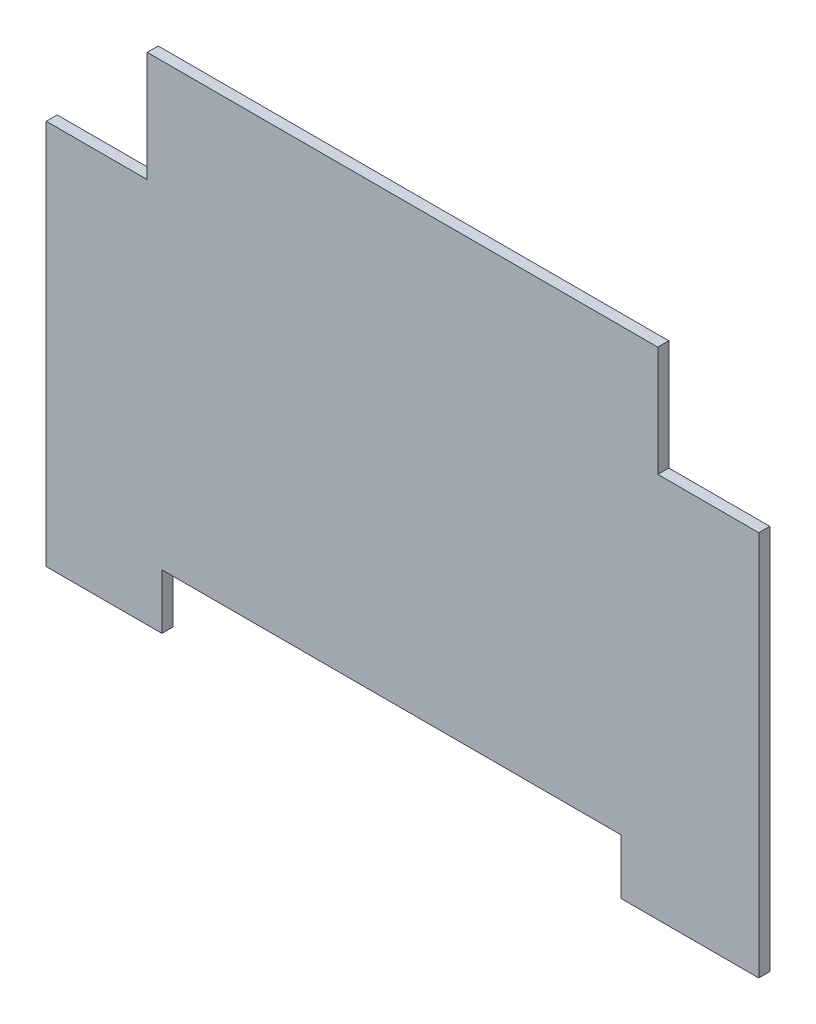
ISO-10303-21;
HEADER;
FILE_DESCRIPTION(('STEP AP214'),'2;1');
FILE_NAME('part.step','',(''),(''),'','','');
FILE_SCHEMA(('AUTOMOTIVE_DESIGN { 1 0 10303 214 1 1 1 1 }'));
ENDSEC;
DATA;
#1=APPLICATION_CONTEXT('core data for automotive mechanical design processes');
#2=APPLICATION_PROTOCOL_DEFINITION('international standard','automotive_design',2000,#1);
#3=PRODUCT_CONTEXT('',#1,'mechanical');
#4=PRODUCT('Part','Part','',(#3));
#5=PRODUCT_RELATED_PRODUCT_CATEGORY('part','',(#4));
#6=PRODUCT_DEFINITION_FORMATION('','',#4);
#7=PRODUCT_DEFINITION_CONTEXT('part definition',#1,'design');
#8=PRODUCT_DEFINITION('design','',#6,#7);
#9=PRODUCT_DEFINITION_SHAPE('','',#8);
#10=(LENGTH_UNIT() NAMED_UNIT(*) SI_UNIT(.MILLI.,.METRE.));
#11=(NAMED_UNIT(*) PLANE_ANGLE_UNIT() SI_UNIT($,.RADIAN.));
#12=(NAMED_UNIT(*) SI_UNIT($,.STERADIAN.) SOLID_ANGLE_UNIT());
#13=UNCERTAINTY_MEASURE_WITH_UNIT(LENGTH_MEASURE(1.E-05),#10,'distance_accuracy_value','');
#14=(GEOMETRIC_REPRESENTATION_CONTEXT(3) GLOBAL_UNCERTAINTY_ASSIGNED_CONTEXT((#13)) GLOBAL_UNIT_ASSIGNED_CONTEXT((#10,
#11,#12)) REPRESENTATION_CONTEXT('',''));
#15=CARTESIAN_POINT('',(0.,0.,0.));
#16=DIRECTION('',(0.,0.,1.));
#17=DIRECTION('',(1.,0.,0.));
#18=AXIS2_PLACEMENT_3D('',#15,#16,#17);
#19=CARTESIAN_POINT('',(-110.868616619322,-9.33319792428152,6.));
#20=DIRECTION('',(0.,1.,0.));
#21=DIRECTION('',(0.,0.,1.));
#22=AXIS2_PLACEMENT_3D('',#19,#20,#21);
#23=PLANE('',#22);
#24=DIRECTION('',(1.,0.,0.));
#25=VECTOR('',#24,1.);
#26=CARTESIAN_POINT('',(-110.868616619322,-9.33319792428152,0.));
#27=LINE('',#26,#25);
#28=CARTESIAN_POINT('',(-110.868616619322,-9.33319792428152,0.));
#29=VERTEX_POINT('',#28);
#30=CARTESIAN_POINT('',(-47.8686166193217,-9.33319792428152,0.));
#31=VERTEX_POINT('',#30);
#32=EDGE_CURVE('E202',#29,#31,#27,.T.);
#33=ORIENTED_EDGE('',*,*,#32,.T.);
#34=DIRECTION('',(0.,0.,-1.));
#35=VECTOR('',#34,1.);
#36=CARTESIAN_POINT('',(-47.8686166193217,-9.33319792428152,10.));
#37=LINE('',#36,#35);
#38=CARTESIAN_POINT('',(-47.8686166193217,-9.33319792428152,6.));
#39=VERTEX_POINT('',#38);
#40=EDGE_CURVE('E149',#39,#31,#37,.T.);
#41=ORIENTED_EDGE('',*,*,#40,.F.);
#42=DIRECTION('',(1.,0.,0.));
#43=VECTOR('',#42,1.);
#44=CARTESIAN_POINT('',(-110.868616619322,-9.33319792428152,6.));
#45=LINE('',#44,#43);
#46=CARTESIAN_POINT('',(-110.868616619322,-9.33319792428152,6.));
#47=VERTEX_POINT('',#46);
#48=EDGE_CURVE('E192',#47,#39,#45,.T.);
#49=ORIENTED_EDGE('',*,*,#48,.F.);
#50=DIRECTION('',(0.,0.,-1.));
#51=VECTOR('',#50,1.);
#52=CARTESIAN_POINT('',(-110.868616619322,-9.33319792428152,6.));
#53=LINE('',#52,#51);
#54=EDGE_CURVE('E11',#47,#29,#53,.T.);
#55=ORIENTED_EDGE('',*,*,#54,.T.);
#56=EDGE_LOOP('',(#33,#41,#49,#55));
#57=FACE_BOUND('',#56,.T.);
#58=ADVANCED_FACE('F33',(#57),#23,.F.);
#59=CARTESIAN_POINT('',(-110.868616619322,260.666802075719,6.));
#60=DIRECTION('',(1.,0.,0.));
#61=DIRECTION('',(0.,1.,0.));
#62=AXIS2_PLACEMENT_3D('',#59,#60,#61);
#63=PLANE('',#62);
#64=DIRECTION('',(0.,-1.,0.));
#65=VECTOR('',#64,1.);
#66=CARTESIAN_POINT('',(-110.868616619322,260.666802075719,6.));
#67=LINE('',#66,#65);
#68=CARTESIAN_POINT('',(-110.868616619322,200.666802075719,6.));
#69=VERTEX_POINT('',#68);
#70=EDGE_CURVE('E188',#69,#47,#67,.T.);
#71=ORIENTED_EDGE('',*,*,#70,.F.);
#72=DIRECTION('',(0.,0.,-1.));
#73=VECTOR('',#72,1.);
#74=CARTESIAN_POINT('',(-110.868616619322,200.666802075719,40.));
#75=LINE('',#74,#73);
#76=CARTESIAN_POINT('',(-110.868616619322,200.666802075719,0.));
#77=VERTEX_POINT('',#76);
#78=EDGE_CURVE('E161',#69,#77,#75,.T.);
#79=ORIENTED_EDGE('',*,*,#78,.T.);
#80=DIRECTION('',(0.,-1.,0.));
#81=VECTOR('',#80,1.);
#82=CARTESIAN_POINT('',(-110.868616619322,260.666802075719,0.));
#83=LINE('',#82,#81);
#84=EDGE_CURVE('E187',#77,#29,#83,.T.);
#85=ORIENTED_EDGE('',*,*,#84,.T.);
#86=ORIENTED_EDGE('',*,*,#54,.F.);
#87=EDGE_LOOP('',(#71,#79,#85,#86));
#88=FACE_BOUND('',#87,.T.);
#89=ADVANCED_FACE('F35',(#88),#63,.F.);
#90=CARTESIAN_POINT('',(202.131383380678,-9.33319792428155,6.));
#91=VERTEX_POINT('',#90);
#92=CARTESIAN_POINT('',(277.131383380678,-9.33319792428152,6.));
#93=VERTEX_POINT('',#92);
#94=EDGE_CURVE('E190',#91,#93,#45,.T.);
#95=ORIENTED_EDGE('',*,*,#94,.F.);
#96=DIRECTION('',(0.,0.,-1.));
#97=VECTOR('',#96,1.);
#98=CARTESIAN_POINT('',(202.131383380678,-9.33319792428155,10.));
#99=LINE('',#98,#97);
#100=CARTESIAN_POINT('',(202.131383380678,-9.33319792428155,0.));
#101=VERTEX_POINT('',#100);
#102=EDGE_CURVE('E133',#91,#101,#99,.T.);
#103=ORIENTED_EDGE('',*,*,#102,.T.);
#104=CARTESIAN_POINT('',(277.131383380678,-9.33319792428152,0.));
#105=VERTEX_POINT('',#104);
#106=EDGE_CURVE('E144',#101,#105,#27,.T.);
#107=ORIENTED_EDGE('',*,*,#106,.T.);
#108=DIRECTION('',(0.,0.,-1.));
#109=VECTOR('',#108,1.);
#110=CARTESIAN_POINT('',(277.131383380678,-9.33319792428152,6.));
#111=LINE('',#110,#109);
#112=EDGE_CURVE('E41',#93,#105,#111,.T.);
#113=ORIENTED_EDGE('',*,*,#112,.F.);
#114=EDGE_LOOP('',(#95,#103,#107,#113));
#115=FACE_BOUND('',#114,.T.);
#116=ADVANCED_FACE('F227',(#115),#23,.F.);
#117=CARTESIAN_POINT('',(277.131383380678,260.666802075719,6.));
#118=DIRECTION('',(-1.,0.,0.));
#119=DIRECTION('',(0.,-1.,0.));
#120=AXIS2_PLACEMENT_3D('',#117,#118,#119);
#121=PLANE('',#120);
#122=DIRECTION('',(0.,1.,0.));
#123=VECTOR('',#122,1.);
#124=CARTESIAN_POINT('',(277.131383380678,260.666802075719,0.));
#125=LINE('',#124,#123);
#126=CARTESIAN_POINT('',(277.131383380678,200.666802075719,0.));
#127=VERTEX_POINT('',#126);
#128=EDGE_CURVE('E205',#105,#127,#125,.T.);
#129=ORIENTED_EDGE('',*,*,#128,.T.);
#130=DIRECTION('',(0.,0.,-1.));
#131=VECTOR('',#130,1.);
#132=CARTESIAN_POINT('',(277.131383380678,200.666802075719,40.));
#133=LINE('',#132,#131);
#134=CARTESIAN_POINT('',(277.131383380678,200.666802075719,6.));
#135=VERTEX_POINT('',#134);
#136=EDGE_CURVE('E56',#135,#127,#133,.T.);
#137=ORIENTED_EDGE('',*,*,#136,.F.);
#138=DIRECTION('',(0.,1.,0.));
#139=VECTOR('',#138,1.);
#140=CARTESIAN_POINT('',(277.131383380678,260.666802075719,6.));
#141=LINE('',#140,#139);
#142=EDGE_CURVE('E195',#93,#135,#141,.T.);
#143=ORIENTED_EDGE('',*,*,#142,.F.);
#144=ORIENTED_EDGE('',*,*,#112,.T.);
#145=EDGE_LOOP('',(#129,#137,#143,#144));
#146=FACE_BOUND('',#145,.T.);
#147=ADVANCED_FACE('F213',(#146),#121,.F.);
#148=CARTESIAN_POINT('',(-110.868616619322,260.666802075719,6.));
#149=DIRECTION('',(0.,-1.,0.));
#150=DIRECTION('',(0.,0.,-1.));
#151=AXIS2_PLACEMENT_3D('',#148,#149,#150);
#152=PLANE('',#151);
#153=DIRECTION('',(-1.,0.,0.));
#154=VECTOR('',#153,1.);
#155=CARTESIAN_POINT('',(-110.868616619322,260.666802075719,6.));
#156=LINE('',#155,#154);
#157=CARTESIAN_POINT('',(222.131383380678,260.666802075719,6.));
#158=VERTEX_POINT('',#157);
#159=CARTESIAN_POINT('',(-55.8686166193218,260.666802075719,6.));
#160=VERTEX_POINT('',#159);
#161=EDGE_CURVE('E198',#158,#160,#156,.T.);
#162=ORIENTED_EDGE('',*,*,#161,.F.);
#163=DIRECTION('',(0.,0.,-1.));
#164=VECTOR('',#163,1.);
#165=CARTESIAN_POINT('',(222.131383380678,260.666802075719,40.));
#166=LINE('',#165,#164);
#167=CARTESIAN_POINT('',(222.131383380678,260.666802075719,0.));
#168=VERTEX_POINT('',#167);
#169=EDGE_CURVE('E163',#158,#168,#166,.T.);
#170=ORIENTED_EDGE('',*,*,#169,.T.);
#171=DIRECTION('',(-1.,0.,0.));
#172=VECTOR('',#171,1.);
#173=CARTESIAN_POINT('',(-110.868616619322,260.666802075719,0.));
#174=LINE('',#173,#172);
#175=CARTESIAN_POINT('',(-55.8686166193218,260.666802075719,0.));
#176=VERTEX_POINT('',#175);
#177=EDGE_CURVE('E191',#168,#176,#174,.T.);
#178=ORIENTED_EDGE('',*,*,#177,.T.);
#179=DIRECTION('',(0.,0.,-1.));
#180=VECTOR('',#179,1.);
#181=CARTESIAN_POINT('',(-55.8686166193218,260.666802075719,40.));
#182=LINE('',#181,#180);
#183=EDGE_CURVE('E174',#160,#176,#182,.T.);
#184=ORIENTED_EDGE('',*,*,#183,.F.);
#185=EDGE_LOOP('',(#162,#170,#178,#184));
#186=FACE_BOUND('',#185,.T.);
#187=ADVANCED_FACE('F233',(#186),#152,.F.);
#188=CARTESIAN_POINT('',(0.,0.,6.));
#189=DIRECTION('',(0.,0.,1.));
#190=DIRECTION('',(1.,0.,0.));
#191=AXIS2_PLACEMENT_3D('',#188,#189,#190);
#192=PLANE('',#191);
#193=DIRECTION('',(0.,-1.,0.));
#194=VECTOR('',#193,1.);
#195=CARTESIAN_POINT('',(-47.8686166193217,0.,6.));
#196=LINE('',#195,#194);
#197=CARTESIAN_POINT('',(-47.8686166193217,20.6668020757185,6.));
#198=VERTEX_POINT('',#197);
#199=EDGE_CURVE('E155',#198,#39,#196,.T.);
#200=ORIENTED_EDGE('',*,*,#199,.F.);
#201=DIRECTION('',(-1.,0.,0.));
#202=VECTOR('',#201,1.);
#203=CARTESIAN_POINT('',(0.,20.6668020757185,6.));
#204=LINE('',#203,#202);
#205=CARTESIAN_POINT('',(202.131383380678,20.6668020757184,6.));
#206=VERTEX_POINT('',#205);
#207=EDGE_CURVE('E151',#206,#198,#204,.T.);
#208=ORIENTED_EDGE('',*,*,#207,.F.);
#209=DIRECTION('',(0.,1.,0.));
#210=VECTOR('',#209,1.);
#211=CARTESIAN_POINT('',(202.131383380678,0.,6.));
#212=LINE('',#211,#210);
#213=EDGE_CURVE('E130',#91,#206,#212,.T.);
#214=ORIENTED_EDGE('',*,*,#213,.F.);
#215=ORIENTED_EDGE('',*,*,#94,.T.);
#216=ORIENTED_EDGE('',*,*,#142,.T.);
#217=DIRECTION('',(1.,0.,0.));
#218=VECTOR('',#217,1.);
#219=CARTESIAN_POINT('',(0.,200.666802075719,6.));
#220=LINE('',#219,#218);
#221=CARTESIAN_POINT('',(222.131383380678,200.666802075719,6.));
#222=VERTEX_POINT('',#221);
#223=EDGE_CURVE('E183',#222,#135,#220,.T.);
#224=ORIENTED_EDGE('',*,*,#223,.F.);
#225=DIRECTION('',(0.,-1.,0.));
#226=VECTOR('',#225,1.);
#227=CARTESIAN_POINT('',(222.131383380678,0.,6.));
#228=LINE('',#227,#226);
#229=EDGE_CURVE('E185',#158,#222,#228,.T.);
#230=ORIENTED_EDGE('',*,*,#229,.F.);
#231=ORIENTED_EDGE('',*,*,#161,.T.);
#232=DIRECTION('',(0.,1.,0.));
#233=VECTOR('',#232,1.);
#234=CARTESIAN_POINT('',(-55.8686166193217,0.,6.));
#235=LINE('',#234,#233);
#236=CARTESIAN_POINT('',(-55.8686166193218,200.666802075719,6.));
#237=VERTEX_POINT('',#236);
#238=EDGE_CURVE('E166',#237,#160,#235,.T.);
#239=ORIENTED_EDGE('',*,*,#238,.F.);
#240=DIRECTION('',(1.,0.,0.));
#241=VECTOR('',#240,1.);
#242=CARTESIAN_POINT('',(0.,200.666802075719,6.));
#243=LINE('',#242,#241);
#244=EDGE_CURVE('E181',#69,#237,#243,.T.);
#245=ORIENTED_EDGE('',*,*,#244,.F.);
#246=ORIENTED_EDGE('',*,*,#70,.T.);
#247=ORIENTED_EDGE('',*,*,#48,.T.);
#248=EDGE_LOOP('',(#200,#208,#214,#215,#216,#224,#230,#231,#239,#245,#246,#247));
#249=FACE_BOUND('',#248,.T.);
#250=ADVANCED_FACE('F225',(#249),#192,.T.);
#251=CARTESIAN_POINT('',(0.,0.,0.));
#252=DIRECTION('',(0.,0.,1.));
#253=DIRECTION('',(1.,0.,0.));
#254=AXIS2_PLACEMENT_3D('',#251,#252,#253);
#255=PLANE('',#254);
#256=DIRECTION('',(1.,0.,0.));
#257=VECTOR('',#256,1.);
#258=CARTESIAN_POINT('',(-47.8686166193217,20.6668020757185,0.));
#259=LINE('',#258,#257);
#260=CARTESIAN_POINT('',(-47.8686166193217,20.6668020757185,0.));
#261=VERTEX_POINT('',#260);
#262=CARTESIAN_POINT('',(202.131383380678,20.6668020757184,0.));
#263=VERTEX_POINT('',#262);
#264=EDGE_CURVE('E137',#261,#263,#259,.T.);
#265=ORIENTED_EDGE('',*,*,#264,.F.);
#266=DIRECTION('',(0.,1.,0.));
#267=VECTOR('',#266,1.);
#268=CARTESIAN_POINT('',(-47.8686166193217,20.6668020757185,0.));
#269=LINE('',#268,#267);
#270=EDGE_CURVE('E48',#31,#261,#269,.T.);
#271=ORIENTED_EDGE('',*,*,#270,.F.);
#272=ORIENTED_EDGE('',*,*,#32,.F.);
#273=ORIENTED_EDGE('',*,*,#84,.F.);
#274=DIRECTION('',(-1.,0.,0.));
#275=VECTOR('',#274,1.);
#276=CARTESIAN_POINT('',(-110.868616619322,200.666802075719,0.));
#277=LINE('',#276,#275);
#278=CARTESIAN_POINT('',(-55.8686166193218,200.666802075719,0.));
#279=VERTEX_POINT('',#278);
#280=EDGE_CURVE('E172',#279,#77,#277,.T.);
#281=ORIENTED_EDGE('',*,*,#280,.F.);
#282=DIRECTION('',(0.,-1.,0.));
#283=VECTOR('',#282,1.);
#284=CARTESIAN_POINT('',(-55.8686166193218,200.666802075719,0.));
#285=LINE('',#284,#283);
#286=EDGE_CURVE('E157',#176,#279,#285,.T.);
#287=ORIENTED_EDGE('',*,*,#286,.F.);
#288=ORIENTED_EDGE('',*,*,#177,.F.);
#289=DIRECTION('',(0.,1.,0.));
#290=VECTOR('',#289,1.);
#291=CARTESIAN_POINT('',(222.131383380678,200.666802075719,0.));
#292=LINE('',#291,#290);
#293=CARTESIAN_POINT('',(222.131383380678,200.666802075719,0.));
#294=VERTEX_POINT('',#293);
#295=EDGE_CURVE('E160',#294,#168,#292,.T.);
#296=ORIENTED_EDGE('',*,*,#295,.F.);
#297=DIRECTION('',(-1.,0.,0.));
#298=VECTOR('',#297,1.);
#299=CARTESIAN_POINT('',(277.131383380678,200.666802075719,0.));
#300=LINE('',#299,#298);
#301=EDGE_CURVE('E158',#127,#294,#300,.T.);
#302=ORIENTED_EDGE('',*,*,#301,.F.);
#303=ORIENTED_EDGE('',*,*,#128,.F.);
#304=ORIENTED_EDGE('',*,*,#106,.F.);
#305=DIRECTION('',(0.,-1.,0.));
#306=VECTOR('',#305,1.);
#307=CARTESIAN_POINT('',(202.131383380678,20.6668020757184,0.));
#308=LINE('',#307,#306);
#309=EDGE_CURVE('E127',#263,#101,#308,.T.);
#310=ORIENTED_EDGE('',*,*,#309,.F.);
#311=EDGE_LOOP('',(#265,#271,#272,#273,#281,#287,#288,#296,#302,#303,#304,#310));
#312=FACE_BOUND('',#311,.T.);
#313=ADVANCED_FACE('F142',(#312),#255,.F.);
#314=CARTESIAN_POINT('',(-110.868616619322,200.666802075719,40.));
#315=DIRECTION('',(0.,-1.,0.));
#316=DIRECTION('',(0.,0.,-1.));
#317=AXIS2_PLACEMENT_3D('',#314,#315,#316);
#318=PLANE('',#317);
#319=ORIENTED_EDGE('',*,*,#244,.T.);
#320=DIRECTION('',(0.,0.,-1.));
#321=VECTOR('',#320,1.);
#322=CARTESIAN_POINT('',(-55.8686166193218,200.666802075719,40.));
#323=LINE('',#322,#321);
#324=EDGE_CURVE('E177',#237,#279,#323,.T.);
#325=ORIENTED_EDGE('',*,*,#324,.T.);
#326=ORIENTED_EDGE('',*,*,#280,.T.);
#327=ORIENTED_EDGE('',*,*,#78,.F.);
#328=EDGE_LOOP('',(#319,#325,#326,#327));
#329=FACE_BOUND('',#328,.T.);
#330=ADVANCED_FACE('F250',(#329),#318,.F.);
#331=CARTESIAN_POINT('',(-55.8686166193218,200.666802075719,40.));
#332=DIRECTION('',(1.,0.,0.));
#333=DIRECTION('',(0.,1.,0.));
#334=AXIS2_PLACEMENT_3D('',#331,#332,#333);
#335=PLANE('',#334);
#336=ORIENTED_EDGE('',*,*,#238,.T.);
#337=ORIENTED_EDGE('',*,*,#183,.T.);
#338=ORIENTED_EDGE('',*,*,#286,.T.);
#339=ORIENTED_EDGE('',*,*,#324,.F.);
#340=EDGE_LOOP('',(#336,#337,#338,#339));
#341=FACE_BOUND('',#340,.T.);
#342=ADVANCED_FACE('F255',(#341),#335,.F.);
#343=CARTESIAN_POINT('',(222.131383380678,200.666802075719,40.));
#344=DIRECTION('',(-1.,0.,0.));
#345=DIRECTION('',(0.,0.,1.));
#346=AXIS2_PLACEMENT_3D('',#343,#344,#345);
#347=PLANE('',#346);
#348=ORIENTED_EDGE('',*,*,#229,.T.);
#349=DIRECTION('',(0.,0.,-1.));
#350=VECTOR('',#349,1.);
#351=CARTESIAN_POINT('',(222.131383380678,200.666802075719,40.));
#352=LINE('',#351,#350);
#353=EDGE_CURVE('E167',#222,#294,#352,.T.);
#354=ORIENTED_EDGE('',*,*,#353,.T.);
#355=ORIENTED_EDGE('',*,*,#295,.T.);
#356=ORIENTED_EDGE('',*,*,#169,.F.);
#357=EDGE_LOOP('',(#348,#354,#355,#356));
#358=FACE_BOUND('',#357,.T.);
#359=ADVANCED_FACE('F257',(#358),#347,.F.);
#360=CARTESIAN_POINT('',(277.131383380678,200.666802075719,40.));
#361=DIRECTION('',(0.,-1.,0.));
#362=DIRECTION('',(0.,0.,-1.));
#363=AXIS2_PLACEMENT_3D('',#360,#361,#362);
#364=PLANE('',#363);
#365=ORIENTED_EDGE('',*,*,#223,.T.);
#366=ORIENTED_EDGE('',*,*,#136,.T.);
#367=ORIENTED_EDGE('',*,*,#301,.T.);
#368=ORIENTED_EDGE('',*,*,#353,.F.);
#369=EDGE_LOOP('',(#365,#366,#367,#368));
#370=FACE_BOUND('',#369,.T.);
#371=ADVANCED_FACE('F219',(#370),#364,.F.);
#372=CARTESIAN_POINT('',(-47.8686166193217,20.6668020757185,10.));
#373=DIRECTION('',(-1.,0.,0.));
#374=DIRECTION('',(0.,0.,1.));
#375=AXIS2_PLACEMENT_3D('',#372,#373,#374);
#376=PLANE('',#375);
#377=ORIENTED_EDGE('',*,*,#199,.T.);
#378=ORIENTED_EDGE('',*,*,#40,.T.);
#379=ORIENTED_EDGE('',*,*,#270,.T.);
#380=DIRECTION('',(0.,0.,-1.));
#381=VECTOR('',#380,1.);
#382=CARTESIAN_POINT('',(-47.8686166193217,20.6668020757185,10.));
#383=LINE('',#382,#381);
#384=EDGE_CURVE('E134',#198,#261,#383,.T.);
#385=ORIENTED_EDGE('',*,*,#384,.F.);
#386=EDGE_LOOP('',(#377,#378,#379,#385));
#387=FACE_BOUND('',#386,.T.);
#388=ADVANCED_FACE('F264',(#387),#376,.F.);
#389=CARTESIAN_POINT('',(202.131383380678,20.6668020757184,10.));
#390=DIRECTION('',(1.,0.,0.));
#391=DIRECTION('',(0.,0.,-1.));
#392=AXIS2_PLACEMENT_3D('',#389,#390,#391);
#393=PLANE('',#392);
#394=ORIENTED_EDGE('',*,*,#213,.T.);
#395=DIRECTION('',(0.,0.,-1.));
#396=VECTOR('',#395,1.);
#397=CARTESIAN_POINT('',(202.131383380678,20.6668020757184,10.));
#398=LINE('',#397,#396);
#399=EDGE_CURVE('E123',#206,#263,#398,.T.);
#400=ORIENTED_EDGE('',*,*,#399,.T.);
#401=ORIENTED_EDGE('',*,*,#309,.T.);
#402=ORIENTED_EDGE('',*,*,#102,.F.);
#403=EDGE_LOOP('',(#394,#400,#401,#402));
#404=FACE_BOUND('',#403,.T.);
#405=ADVANCED_FACE('F125',(#404),#393,.F.);
#406=CARTESIAN_POINT('',(-47.8686166193217,20.6668020757185,10.));
#407=DIRECTION('',(0.,1.,0.));
#408=DIRECTION('',(-1.,0.,0.));
#409=AXIS2_PLACEMENT_3D('',#406,#407,#408);
#410=PLANE('',#409);
#411=ORIENTED_EDGE('',*,*,#207,.T.);
#412=ORIENTED_EDGE('',*,*,#384,.T.);
#413=ORIENTED_EDGE('',*,*,#264,.T.);
#414=ORIENTED_EDGE('',*,*,#399,.F.);
#415=EDGE_LOOP('',(#411,#412,#413,#414));
#416=FACE_BOUND('',#415,.T.);
#417=ADVANCED_FACE('F138',(#416),#410,.F.);
#418=CLOSED_SHELL('',(#58,#89,#116,#147,#187,#250,#313,#330,#342,#359,#371,#388,#405,#417));
#419=MANIFOLD_SOLID_BREP('B2',#418);
#420=ADVANCED_BREP_SHAPE_REPRESENTATION('',(#18,#419),#14);
#421=SHAPE_DEFINITION_REPRESENTATION(#9,#420);
ENDSEC;
END-ISO-10303-21;
